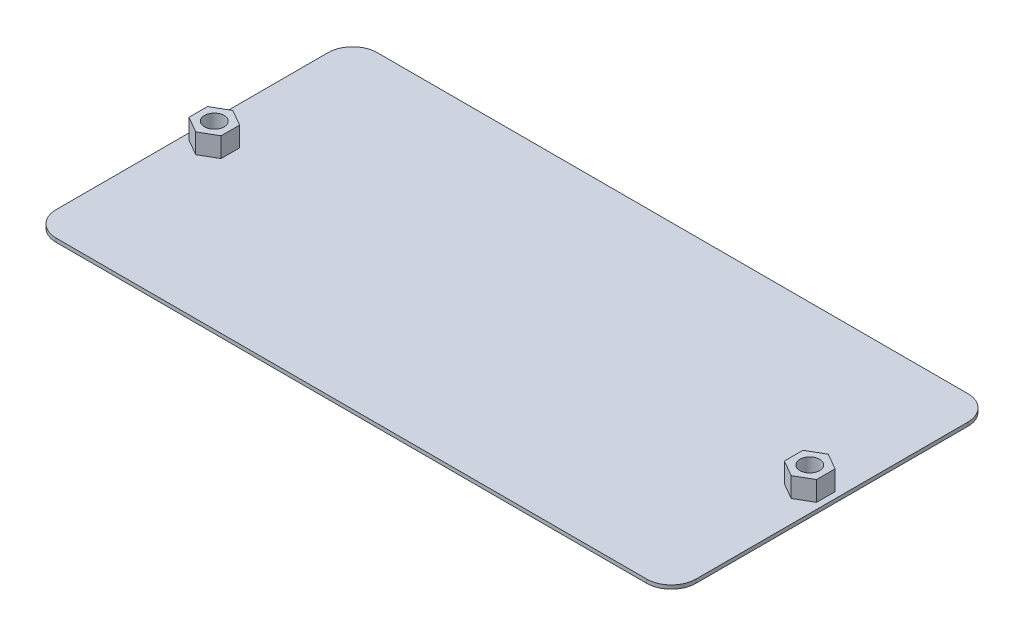
ISO-10303-21;
HEADER;
FILE_DESCRIPTION(('STEP AP214'),'2;1');
FILE_NAME('part.step','',(''),(''),'','','');
FILE_SCHEMA(('AUTOMOTIVE_DESIGN { 1 0 10303 214 1 1 1 1 }'));
ENDSEC;
DATA;
#1=APPLICATION_CONTEXT('core data for automotive mechanical design processes');
#2=APPLICATION_PROTOCOL_DEFINITION('international standard','automotive_design',2000,#1);
#3=PRODUCT_CONTEXT('',#1,'mechanical');
#4=PRODUCT('Part','Part','',(#3));
#5=PRODUCT_RELATED_PRODUCT_CATEGORY('part','',(#4));
#6=PRODUCT_DEFINITION_FORMATION('','',#4);
#7=PRODUCT_DEFINITION_CONTEXT('part definition',#1,'design');
#8=PRODUCT_DEFINITION('design','',#6,#7);
#9=PRODUCT_DEFINITION_SHAPE('','',#8);
#10=(LENGTH_UNIT() NAMED_UNIT(*) SI_UNIT(.MILLI.,.METRE.));
#11=(NAMED_UNIT(*) PLANE_ANGLE_UNIT() SI_UNIT($,.RADIAN.));
#12=(NAMED_UNIT(*) SI_UNIT($,.STERADIAN.) SOLID_ANGLE_UNIT());
#13=UNCERTAINTY_MEASURE_WITH_UNIT(LENGTH_MEASURE(1.E-05),#10,'distance_accuracy_value','');
#14=(GEOMETRIC_REPRESENTATION_CONTEXT(3) GLOBAL_UNCERTAINTY_ASSIGNED_CONTEXT((#13)) GLOBAL_UNIT_ASSIGNED_CONTEXT((#10,
#11,#12)) REPRESENTATION_CONTEXT('',''));
#15=CARTESIAN_POINT('',(0.,0.,0.));
#16=DIRECTION('',(0.,0.,1.));
#17=DIRECTION('',(1.,0.,0.));
#18=AXIS2_PLACEMENT_3D('',#15,#16,#17);
#19=CARTESIAN_POINT('',(249.,1.5,-120.));
#20=DIRECTION('',(0.,-1.,0.));
#21=DIRECTION('',(0.,0.,-1.));
#22=AXIS2_PLACEMENT_3D('',#19,#20,#21);
#23=PLANE('',#22);
#24=DIRECTION('',(0.866025403784438,0.,0.500000000000001));
#25=VECTOR('',#24,1.);
#26=CARTESIAN_POINT('',(2.49999999999997,1.5,-61.2472232502675));
#27=LINE('',#26,#25);
#28=CARTESIAN_POINT('',(2.49999999999997,1.5,-61.2472232502675));
#29=VERTEX_POINT('',#28);
#30=CARTESIAN_POINT('',(8.99999999999984,1.5,-57.4944465005349));
#31=VERTEX_POINT('',#30);
#32=EDGE_CURVE('E229',#29,#31,#27,.T.);
#33=ORIENTED_EDGE('',*,*,#32,.F.);
#34=DIRECTION('',(0.,0.,1.));
#35=VECTOR('',#34,1.);
#36=CARTESIAN_POINT('',(2.49999999999997,1.5,-68.7527767497326));
#37=LINE('',#36,#35);
#38=CARTESIAN_POINT('',(2.5,1.5,-68.7527767497326));
#39=VERTEX_POINT('',#38);
#40=EDGE_CURVE('E238',#39,#29,#37,.T.);
#41=ORIENTED_EDGE('',*,*,#40,.F.);
#42=DIRECTION('',(-0.866025403784439,0.,0.5));
#43=VECTOR('',#42,1.);
#44=CARTESIAN_POINT('',(8.99999999999986,1.5,-72.5055534994652));
#45=LINE('',#44,#43);
#46=CARTESIAN_POINT('',(8.99999999999984,1.5,-72.5055534994652));
#47=VERTEX_POINT('',#46);
#48=EDGE_CURVE('E269',#47,#39,#45,.T.);
#49=ORIENTED_EDGE('',*,*,#48,.F.);
#50=DIRECTION('',(-0.866025403784439,0.,-0.5));
#51=VECTOR('',#50,1.);
#52=CARTESIAN_POINT('',(15.4999999999998,1.5,-68.7527767497326));
#53=LINE('',#52,#51);
#54=CARTESIAN_POINT('',(15.4999999999998,1.5,-68.7527767497326));
#55=VERTEX_POINT('',#54);
#56=EDGE_CURVE('E265',#55,#47,#53,.T.);
#57=ORIENTED_EDGE('',*,*,#56,.F.);
#58=DIRECTION('',(0.,0.,-1.));
#59=VECTOR('',#58,1.);
#60=CARTESIAN_POINT('',(15.4999999999998,1.5,-61.2472232502674));
#61=LINE('',#60,#59);
#62=CARTESIAN_POINT('',(15.4999999999998,1.5,-61.2472232502674));
#63=VERTEX_POINT('',#62);
#64=EDGE_CURVE('E261',#63,#55,#61,.T.);
#65=ORIENTED_EDGE('',*,*,#64,.F.);
#66=DIRECTION('',(0.866025403784439,0.,-0.5));
#67=VECTOR('',#66,1.);
#68=CARTESIAN_POINT('',(8.99999999999984,1.5,-57.4944465005349));
#69=LINE('',#68,#67);
#70=EDGE_CURVE('E257',#31,#63,#69,.T.);
#71=ORIENTED_EDGE('',*,*,#70,.F.);
#72=EDGE_LOOP('',(#33,#41,#49,#57,#65,#71));
#73=FACE_BOUND('',#72,.T.);
#74=CARTESIAN_POINT('',(249.,1.5,-120.));
#75=DIRECTION('',(0.,1.,0.));
#76=DIRECTION('',(0.,0.,-1.));
#77=AXIS2_PLACEMENT_3D('',#74,#75,#76);
#78=CIRCLE('',#77,10.);
#79=CARTESIAN_POINT('',(259.,1.5,-120.));
#80=VERTEX_POINT('',#79);
#81=CARTESIAN_POINT('',(249.,1.5,-130.));
#82=VERTEX_POINT('',#81);
#83=EDGE_CURVE('E312',#80,#82,#78,.T.);
#84=ORIENTED_EDGE('',*,*,#83,.T.);
#85=DIRECTION('',(-1.,0.,0.));
#86=VECTOR('',#85,1.);
#87=CARTESIAN_POINT('',(9.99999999999991,1.5,-130.));
#88=LINE('',#87,#86);
#89=CARTESIAN_POINT('',(9.99999999999991,1.5,-130.));
#90=VERTEX_POINT('',#89);
#91=EDGE_CURVE('E316',#82,#90,#88,.T.);
#92=ORIENTED_EDGE('',*,*,#91,.T.);
#93=CARTESIAN_POINT('',(9.99999999999983,1.5,-120.));
#94=DIRECTION('',(0.,1.,0.));
#95=DIRECTION('',(0.,0.,-1.));
#96=AXIS2_PLACEMENT_3D('',#93,#94,#95);
#97=CIRCLE('',#96,10.);
#98=CARTESIAN_POINT('',(0.,1.5,-120.));
#99=VERTEX_POINT('',#98);
#100=EDGE_CURVE('E320',#90,#99,#97,.T.);
#101=ORIENTED_EDGE('',*,*,#100,.T.);
#102=DIRECTION('',(0.,0.,1.));
#103=VECTOR('',#102,1.);
#104=CARTESIAN_POINT('',(0.,1.5,-10.));
#105=LINE('',#104,#103);
#106=CARTESIAN_POINT('',(0.,1.5,-10.));
#107=VERTEX_POINT('',#106);
#108=EDGE_CURVE('E323',#99,#107,#105,.T.);
#109=ORIENTED_EDGE('',*,*,#108,.T.);
#110=CARTESIAN_POINT('',(9.99999999999984,1.5,-9.99999999999996));
#111=DIRECTION('',(0.,1.,0.));
#112=DIRECTION('',(0.,0.,-1.));
#113=AXIS2_PLACEMENT_3D('',#110,#111,#112);
#114=CIRCLE('',#113,10.);
#115=CARTESIAN_POINT('',(9.99999999999991,1.5,0.));
#116=VERTEX_POINT('',#115);
#117=EDGE_CURVE('E326',#107,#116,#114,.T.);
#118=ORIENTED_EDGE('',*,*,#117,.T.);
#119=DIRECTION('',(1.,0.,0.));
#120=VECTOR('',#119,1.);
#121=CARTESIAN_POINT('',(9.9999999999999,1.5,0.));
#122=LINE('',#121,#120);
#123=CARTESIAN_POINT('',(249.,1.5,0.));
#124=VERTEX_POINT('',#123);
#125=EDGE_CURVE('E329',#116,#124,#122,.T.);
#126=ORIENTED_EDGE('',*,*,#125,.T.);
#127=CARTESIAN_POINT('',(249.,1.5,-9.99999999999999));
#128=DIRECTION('',(0.,1.,0.));
#129=DIRECTION('',(0.,0.,1.));
#130=AXIS2_PLACEMENT_3D('',#127,#128,#129);
#131=CIRCLE('',#130,10.);
#132=CARTESIAN_POINT('',(259.,1.5,-10.));
#133=VERTEX_POINT('',#132);
#134=EDGE_CURVE('E332',#124,#133,#131,.T.);
#135=ORIENTED_EDGE('',*,*,#134,.T.);
#136=DIRECTION('',(0.,0.,-1.));
#137=VECTOR('',#136,1.);
#138=CARTESIAN_POINT('',(259.,1.5,-10.));
#139=LINE('',#138,#137);
#140=EDGE_CURVE('E335',#133,#80,#139,.T.);
#141=ORIENTED_EDGE('',*,*,#140,.T.);
#142=EDGE_LOOP('',(#84,#92,#101,#109,#118,#126,#135,#141));
#143=FACE_BOUND('',#142,.T.);
#144=DIRECTION('',(0.,0.,-1.));
#145=VECTOR('',#144,1.);
#146=CARTESIAN_POINT('',(256.500000000001,1.5,-68.7527767497335));
#147=LINE('',#146,#145);
#148=CARTESIAN_POINT('',(256.500000000001,1.5,-61.2472232502683));
#149=VERTEX_POINT('',#148);
#150=CARTESIAN_POINT('',(256.500000000001,1.5,-68.7527767497335));
#151=VERTEX_POINT('',#150);
#152=EDGE_CURVE('E210',#149,#151,#147,.T.);
#153=ORIENTED_EDGE('',*,*,#152,.F.);
#154=DIRECTION('',(0.86602540378444,0.,-0.499999999999998));
#155=VECTOR('',#154,1.);
#156=CARTESIAN_POINT('',(256.500000000001,1.5,-61.2472232502683));
#157=LINE('',#156,#155);
#158=CARTESIAN_POINT('',(250.000000000001,1.5,-57.4944465005358));
#159=VERTEX_POINT('',#158);
#160=EDGE_CURVE('E207',#159,#149,#157,.T.);
#161=ORIENTED_EDGE('',*,*,#160,.F.);
#162=DIRECTION('',(0.866025403784439,0.,0.499999999999999));
#163=VECTOR('',#162,1.);
#164=CARTESIAN_POINT('',(250.000000000001,1.5,-57.4944465005358));
#165=LINE('',#164,#163);
#166=CARTESIAN_POINT('',(243.5,1.5,-61.2472232502684));
#167=VERTEX_POINT('',#166);
#168=EDGE_CURVE('E587',#167,#159,#165,.T.);
#169=ORIENTED_EDGE('',*,*,#168,.F.);
#170=DIRECTION('',(0.,0.,1.));
#171=VECTOR('',#170,1.);
#172=CARTESIAN_POINT('',(243.5,1.5,-61.2472232502684));
#173=LINE('',#172,#171);
#174=CARTESIAN_POINT('',(243.5,1.5,-68.7527767497335));
#175=VERTEX_POINT('',#174);
#176=EDGE_CURVE('E583',#175,#167,#173,.T.);
#177=ORIENTED_EDGE('',*,*,#176,.F.);
#178=DIRECTION('',(-0.866025403784438,0.,0.500000000000001));
#179=VECTOR('',#178,1.);
#180=CARTESIAN_POINT('',(243.5,1.5,-68.7527767497335));
#181=LINE('',#180,#179);
#182=CARTESIAN_POINT('',(250.,1.5,-72.505553499466));
#183=VERTEX_POINT('',#182);
#184=EDGE_CURVE('E70',#183,#175,#181,.T.);
#185=ORIENTED_EDGE('',*,*,#184,.F.);
#186=DIRECTION('',(-0.866025403784442,0.,-0.499999999999995));
#187=VECTOR('',#186,1.);
#188=CARTESIAN_POINT('',(250.,1.5,-72.5055534994661));
#189=LINE('',#188,#187);
#190=EDGE_CURVE('E65',#151,#183,#189,.T.);
#191=ORIENTED_EDGE('',*,*,#190,.F.);
#192=EDGE_LOOP('',(#153,#161,#169,#177,#185,#191));
#193=FACE_BOUND('',#192,.T.);
#194=ADVANCED_FACE('F49',(#73,#143,#193),#23,.F.);
#195=CARTESIAN_POINT('',(249.,0.,-120.));
#196=DIRECTION('',(0.,-1.,0.));
#197=DIRECTION('',(0.,0.,-1.));
#198=AXIS2_PLACEMENT_3D('',#195,#196,#197);
#199=PLANE('',#198);
#200=CARTESIAN_POINT('',(8.99999999999984,0.,-65.0000000000001));
#201=DIRECTION('',(0.,1.,0.));
#202=DIRECTION('',(0.,0.,1.));
#203=AXIS2_PLACEMENT_3D('',#200,#201,#202);
#204=CIRCLE('',#203,4.5);
#205=CARTESIAN_POINT('',(8.99999999999984,0.,-60.5000000000001));
#206=VERTEX_POINT('',#205);
#207=EDGE_CURVE('E307',#206,#206,#204,.T.);
#208=ORIENTED_EDGE('',*,*,#207,.T.);
#209=EDGE_LOOP('',(#208));
#210=FACE_BOUND('',#209,.T.);
#211=CARTESIAN_POINT('',(249.,0.,-120.));
#212=DIRECTION('',(0.,1.,0.));
#213=DIRECTION('',(0.,0.,-1.));
#214=AXIS2_PLACEMENT_3D('',#211,#212,#213);
#215=CIRCLE('',#214,10.);
#216=CARTESIAN_POINT('',(259.,0.,-120.));
#217=VERTEX_POINT('',#216);
#218=CARTESIAN_POINT('',(249.,0.,-130.));
#219=VERTEX_POINT('',#218);
#220=EDGE_CURVE('E311',#217,#219,#215,.T.);
#221=ORIENTED_EDGE('',*,*,#220,.F.);
#222=DIRECTION('',(0.,0.,-1.));
#223=VECTOR('',#222,1.);
#224=CARTESIAN_POINT('',(259.,0.,-10.));
#225=LINE('',#224,#223);
#226=CARTESIAN_POINT('',(259.,0.,-10.));
#227=VERTEX_POINT('',#226);
#228=EDGE_CURVE('E317',#227,#217,#225,.T.);
#229=ORIENTED_EDGE('',*,*,#228,.F.);
#230=CARTESIAN_POINT('',(249.,0.,-9.99999999999999));
#231=DIRECTION('',(0.,1.,0.));
#232=DIRECTION('',(0.,0.,1.));
#233=AXIS2_PLACEMENT_3D('',#230,#231,#232);
#234=CIRCLE('',#233,10.);
#235=CARTESIAN_POINT('',(249.,0.,0.));
#236=VERTEX_POINT('',#235);
#237=EDGE_CURVE('E357',#236,#227,#234,.T.);
#238=ORIENTED_EDGE('',*,*,#237,.F.);
#239=DIRECTION('',(1.,0.,0.));
#240=VECTOR('',#239,1.);
#241=CARTESIAN_POINT('',(9.9999999999999,0.,0.));
#242=LINE('',#241,#240);
#243=CARTESIAN_POINT('',(9.99999999999991,0.,0.));
#244=VERTEX_POINT('',#243);
#245=EDGE_CURVE('E354',#244,#236,#242,.T.);
#246=ORIENTED_EDGE('',*,*,#245,.F.);
#247=CARTESIAN_POINT('',(9.99999999999984,0.,-9.99999999999996));
#248=DIRECTION('',(0.,1.,0.));
#249=DIRECTION('',(0.,0.,-1.));
#250=AXIS2_PLACEMENT_3D('',#247,#248,#249);
#251=CIRCLE('',#250,10.);
#252=CARTESIAN_POINT('',(0.,0.,-10.));
#253=VERTEX_POINT('',#252);
#254=EDGE_CURVE('E351',#253,#244,#251,.T.);
#255=ORIENTED_EDGE('',*,*,#254,.F.);
#256=DIRECTION('',(0.,0.,1.));
#257=VECTOR('',#256,1.);
#258=CARTESIAN_POINT('',(0.,0.,-10.));
#259=LINE('',#258,#257);
#260=CARTESIAN_POINT('',(0.,0.,-120.));
#261=VERTEX_POINT('',#260);
#262=EDGE_CURVE('E348',#261,#253,#259,.T.);
#263=ORIENTED_EDGE('',*,*,#262,.F.);
#264=CARTESIAN_POINT('',(9.99999999999983,0.,-120.));
#265=DIRECTION('',(0.,1.,0.));
#266=DIRECTION('',(0.,0.,-1.));
#267=AXIS2_PLACEMENT_3D('',#264,#265,#266);
#268=CIRCLE('',#267,10.);
#269=CARTESIAN_POINT('',(9.99999999999991,0.,-130.));
#270=VERTEX_POINT('',#269);
#271=EDGE_CURVE('E345',#270,#261,#268,.T.);
#272=ORIENTED_EDGE('',*,*,#271,.F.);
#273=DIRECTION('',(-1.,0.,0.));
#274=VECTOR('',#273,1.);
#275=CARTESIAN_POINT('',(9.99999999999991,0.,-130.));
#276=LINE('',#275,#274);
#277=EDGE_CURVE('E342',#219,#270,#276,.T.);
#278=ORIENTED_EDGE('',*,*,#277,.F.);
#279=EDGE_LOOP('',(#221,#229,#238,#246,#255,#263,#272,#278));
#280=FACE_BOUND('',#279,.T.);
#281=CARTESIAN_POINT('',(250.,0.,-65.000000000001));
#282=DIRECTION('',(0.,1.,0.));
#283=DIRECTION('',(0.,0.,-1.));
#284=AXIS2_PLACEMENT_3D('',#281,#282,#283);
#285=CIRCLE('',#284,4.50000000000002);
#286=CARTESIAN_POINT('',(250.,0.,-69.500000000001));
#287=VERTEX_POINT('',#286);
#288=EDGE_CURVE('E303',#287,#287,#285,.T.);
#289=ORIENTED_EDGE('',*,*,#288,.T.);
#290=EDGE_LOOP('',(#289));
#291=FACE_BOUND('',#290,.T.);
#292=ADVANCED_FACE('F398',(#210,#280,#291),#199,.T.);
#293=CARTESIAN_POINT('',(249.,1.5,-120.));
#294=DIRECTION('',(0.,-1.,0.));
#295=DIRECTION('',(0.,0.,-1.));
#296=AXIS2_PLACEMENT_3D('',#293,#294,#295);
#297=CYLINDRICAL_SURFACE('',#296,10.);
#298=ORIENTED_EDGE('',*,*,#220,.T.);
#299=DIRECTION('',(0.,-1.,0.));
#300=VECTOR('',#299,1.);
#301=CARTESIAN_POINT('',(249.,1.5,-130.));
#302=LINE('',#301,#300);
#303=EDGE_CURVE('E11',#82,#219,#302,.T.);
#304=ORIENTED_EDGE('',*,*,#303,.F.);
#305=ORIENTED_EDGE('',*,*,#83,.F.);
#306=DIRECTION('',(0.,-1.,0.));
#307=VECTOR('',#306,1.);
#308=CARTESIAN_POINT('',(259.,1.5,-120.));
#309=LINE('',#308,#307);
#310=EDGE_CURVE('E338',#80,#217,#309,.T.);
#311=ORIENTED_EDGE('',*,*,#310,.T.);
#312=EDGE_LOOP('',(#298,#304,#305,#311));
#313=FACE_BOUND('',#312,.T.);
#314=ADVANCED_FACE('F51',(#313),#297,.T.);
#315=CARTESIAN_POINT('',(9.99999999999991,1.5,-130.));
#316=DIRECTION('',(0.,0.,1.));
#317=DIRECTION('',(1.,0.,0.));
#318=AXIS2_PLACEMENT_3D('',#315,#316,#317);
#319=PLANE('',#318);
#320=ORIENTED_EDGE('',*,*,#277,.T.);
#321=DIRECTION('',(0.,-1.,0.));
#322=VECTOR('',#321,1.);
#323=CARTESIAN_POINT('',(9.99999999999991,1.5,-130.));
#324=LINE('',#323,#322);
#325=EDGE_CURVE('E58',#90,#270,#324,.T.);
#326=ORIENTED_EDGE('',*,*,#325,.F.);
#327=ORIENTED_EDGE('',*,*,#91,.F.);
#328=ORIENTED_EDGE('',*,*,#303,.T.);
#329=EDGE_LOOP('',(#320,#326,#327,#328));
#330=FACE_BOUND('',#329,.T.);
#331=ADVANCED_FACE('F415',(#330),#319,.F.);
#332=CARTESIAN_POINT('',(9.99999999999983,1.5,-120.));
#333=DIRECTION('',(0.,-1.,0.));
#334=DIRECTION('',(0.,0.,-1.));
#335=AXIS2_PLACEMENT_3D('',#332,#333,#334);
#336=CYLINDRICAL_SURFACE('',#335,10.);
#337=ORIENTED_EDGE('',*,*,#271,.T.);
#338=DIRECTION('',(0.,-1.,0.));
#339=VECTOR('',#338,1.);
#340=CARTESIAN_POINT('',(0.,1.5,-120.));
#341=LINE('',#340,#339);
#342=EDGE_CURVE('E381',#99,#261,#341,.T.);
#343=ORIENTED_EDGE('',*,*,#342,.F.);
#344=ORIENTED_EDGE('',*,*,#100,.F.);
#345=ORIENTED_EDGE('',*,*,#325,.T.);
#346=EDGE_LOOP('',(#337,#343,#344,#345));
#347=FACE_BOUND('',#346,.T.);
#348=ADVANCED_FACE('F392',(#347),#336,.T.);
#349=CARTESIAN_POINT('',(0.,1.5,-10.));
#350=DIRECTION('',(1.,0.,0.));
#351=DIRECTION('',(0.,0.,-1.));
#352=AXIS2_PLACEMENT_3D('',#349,#350,#351);
#353=PLANE('',#352);
#354=ORIENTED_EDGE('',*,*,#262,.T.);
#355=DIRECTION('',(0.,-1.,0.));
#356=VECTOR('',#355,1.);
#357=CARTESIAN_POINT('',(0.,1.5,-10.));
#358=LINE('',#357,#356);
#359=EDGE_CURVE('E377',#107,#253,#358,.T.);
#360=ORIENTED_EDGE('',*,*,#359,.F.);
#361=ORIENTED_EDGE('',*,*,#108,.F.);
#362=ORIENTED_EDGE('',*,*,#342,.T.);
#363=EDGE_LOOP('',(#354,#360,#361,#362));
#364=FACE_BOUND('',#363,.T.);
#365=ADVANCED_FACE('F404',(#364),#353,.F.);
#366=CARTESIAN_POINT('',(9.99999999999984,1.5,-9.99999999999996));
#367=DIRECTION('',(0.,-1.,0.));
#368=DIRECTION('',(0.,0.,-1.));
#369=AXIS2_PLACEMENT_3D('',#366,#367,#368);
#370=CYLINDRICAL_SURFACE('',#369,10.);
#371=ORIENTED_EDGE('',*,*,#254,.T.);
#372=DIRECTION('',(0.,-1.,0.));
#373=VECTOR('',#372,1.);
#374=CARTESIAN_POINT('',(9.99999999999991,1.5,0.));
#375=LINE('',#374,#373);
#376=EDGE_CURVE('E373',#116,#244,#375,.T.);
#377=ORIENTED_EDGE('',*,*,#376,.F.);
#378=ORIENTED_EDGE('',*,*,#117,.F.);
#379=ORIENTED_EDGE('',*,*,#359,.T.);
#380=EDGE_LOOP('',(#371,#377,#378,#379));
#381=FACE_BOUND('',#380,.T.);
#382=ADVANCED_FACE('F408',(#381),#370,.T.);
#383=CARTESIAN_POINT('',(9.9999999999999,1.5,0.));
#384=DIRECTION('',(0.,0.,-1.));
#385=DIRECTION('',(-1.,0.,0.));
#386=AXIS2_PLACEMENT_3D('',#383,#384,#385);
#387=PLANE('',#386);
#388=ORIENTED_EDGE('',*,*,#245,.T.);
#389=DIRECTION('',(0.,-1.,0.));
#390=VECTOR('',#389,1.);
#391=CARTESIAN_POINT('',(249.,1.5,0.));
#392=LINE('',#391,#390);
#393=EDGE_CURVE('E369',#124,#236,#392,.T.);
#394=ORIENTED_EDGE('',*,*,#393,.F.);
#395=ORIENTED_EDGE('',*,*,#125,.F.);
#396=ORIENTED_EDGE('',*,*,#376,.T.);
#397=EDGE_LOOP('',(#388,#394,#395,#396));
#398=FACE_BOUND('',#397,.T.);
#399=ADVANCED_FACE('F428',(#398),#387,.F.);
#400=CARTESIAN_POINT('',(249.,1.5,-9.99999999999999));
#401=DIRECTION('',(0.,-1.,0.));
#402=DIRECTION('',(0.,0.,-1.));
#403=AXIS2_PLACEMENT_3D('',#400,#401,#402);
#404=CYLINDRICAL_SURFACE('',#403,10.);
#405=ORIENTED_EDGE('',*,*,#237,.T.);
#406=DIRECTION('',(0.,-1.,0.));
#407=VECTOR('',#406,1.);
#408=CARTESIAN_POINT('',(259.,1.5,-10.));
#409=LINE('',#408,#407);
#410=EDGE_CURVE('E365',#133,#227,#409,.T.);
#411=ORIENTED_EDGE('',*,*,#410,.F.);
#412=ORIENTED_EDGE('',*,*,#134,.F.);
#413=ORIENTED_EDGE('',*,*,#393,.T.);
#414=EDGE_LOOP('',(#405,#411,#412,#413));
#415=FACE_BOUND('',#414,.T.);
#416=ADVANCED_FACE('F426',(#415),#404,.T.);
#417=CARTESIAN_POINT('',(259.,1.5,-10.));
#418=DIRECTION('',(-1.,0.,0.));
#419=DIRECTION('',(0.,0.,1.));
#420=AXIS2_PLACEMENT_3D('',#417,#418,#419);
#421=PLANE('',#420);
#422=ORIENTED_EDGE('',*,*,#228,.T.);
#423=ORIENTED_EDGE('',*,*,#310,.F.);
#424=ORIENTED_EDGE('',*,*,#140,.F.);
#425=ORIENTED_EDGE('',*,*,#410,.T.);
#426=EDGE_LOOP('',(#422,#423,#424,#425));
#427=FACE_BOUND('',#426,.T.);
#428=ADVANCED_FACE('F421',(#427),#421,.F.);
#429=CARTESIAN_POINT('',(8.99999999999984,1.5,-65.0000000000001));
#430=DIRECTION('',(0.,-1.,0.));
#431=DIRECTION('',(0.,0.,-1.));
#432=AXIS2_PLACEMENT_3D('',#429,#430,#431);
#433=CYLINDRICAL_SURFACE('',#432,4.5);
#434=CARTESIAN_POINT('',(8.99999999999984,1.5,-65.0000000000001));
#435=DIRECTION('',(0.,1.,0.));
#436=DIRECTION('',(0.,0.,1.));
#437=AXIS2_PLACEMENT_3D('',#434,#435,#436);
#438=CIRCLE('',#437,4.5);
#439=CARTESIAN_POINT('',(8.99999999999984,1.5,-60.5000000000001));
#440=VERTEX_POINT('',#439);
#441=EDGE_CURVE('E299',#440,#440,#438,.T.);
#442=ORIENTED_EDGE('',*,*,#441,.T.);
#443=EDGE_LOOP('',(#442));
#444=FACE_BOUND('',#443,.T.);
#445=ORIENTED_EDGE('',*,*,#207,.F.);
#446=EDGE_LOOP('',(#445));
#447=FACE_BOUND('',#446,.T.);
#448=ADVANCED_FACE('F446',(#444,#447),#433,.F.);
#449=CARTESIAN_POINT('',(250.,1.5,-65.000000000001));
#450=DIRECTION('',(0.,-1.,0.));
#451=DIRECTION('',(0.,0.,-1.));
#452=AXIS2_PLACEMENT_3D('',#449,#450,#451);
#453=CYLINDRICAL_SURFACE('',#452,4.50000000000002);
#454=CARTESIAN_POINT('',(250.,1.5,-65.000000000001));
#455=DIRECTION('',(0.,-1.,0.));
#456=DIRECTION('',(0.,0.,-1.));
#457=AXIS2_PLACEMENT_3D('',#454,#455,#456);
#458=CIRCLE('',#457,4.50000000000002);
#459=CARTESIAN_POINT('',(250.,1.5,-69.500000000001));
#460=VERTEX_POINT('',#459);
#461=EDGE_CURVE('E212',#460,#460,#458,.T.);
#462=ORIENTED_EDGE('',*,*,#461,.F.);
#463=EDGE_LOOP('',(#462));
#464=FACE_BOUND('',#463,.T.);
#465=ORIENTED_EDGE('',*,*,#288,.F.);
#466=EDGE_LOOP('',(#465));
#467=FACE_BOUND('',#466,.T.);
#468=ADVANCED_FACE('F453',(#464,#467),#453,.F.);
#469=CARTESIAN_POINT('',(0.,1.5,0.));
#470=DIRECTION('',(0.,1.,0.));
#471=DIRECTION('',(0.,0.,1.));
#472=AXIS2_PLACEMENT_3D('',#469,#470,#471);
#473=PLANE('',#472);
#474=CARTESIAN_POINT('',(8.99999999999984,1.5,-65.0000000000001));
#475=DIRECTION('',(0.,1.,0.));
#476=DIRECTION('',(0.,0.,-1.));
#477=AXIS2_PLACEMENT_3D('',#474,#475,#476);
#478=CIRCLE('',#477,4.00000000000002);
#479=CARTESIAN_POINT('',(8.99999999999984,1.5,-69.0000000000001));
#480=VERTEX_POINT('',#479);
#481=EDGE_CURVE('E219',#480,#480,#478,.T.);
#482=ORIENTED_EDGE('',*,*,#481,.T.);
#483=EDGE_LOOP('',(#482));
#484=FACE_BOUND('',#483,.T.);
#485=ORIENTED_EDGE('',*,*,#441,.F.);
#486=EDGE_LOOP('',(#485));
#487=FACE_BOUND('',#486,.T.);
#488=ADVANCED_FACE('F458',(#484,#487),#473,.F.);
#489=CARTESIAN_POINT('',(0.,9.50000000000001,0.));
#490=DIRECTION('',(0.,1.,0.));
#491=DIRECTION('',(0.,0.,1.));
#492=AXIS2_PLACEMENT_3D('',#489,#490,#491);
#493=PLANE('',#492);
#494=DIRECTION('',(0.866025403784438,0.,0.500000000000001));
#495=VECTOR('',#494,1.);
#496=CARTESIAN_POINT('',(2.49999999999997,9.50000000000001,-61.2472232502675));
#497=LINE('',#496,#495);
#498=CARTESIAN_POINT('',(2.49999999999997,9.50000000000001,-61.2472232502675));
#499=VERTEX_POINT('',#498);
#500=CARTESIAN_POINT('',(8.99999999999984,9.50000000000001,-57.4944465005349));
#501=VERTEX_POINT('',#500);
#502=EDGE_CURVE('E233',#499,#501,#497,.T.);
#503=ORIENTED_EDGE('',*,*,#502,.T.);
#504=DIRECTION('',(0.866025403784439,0.,-0.5));
#505=VECTOR('',#504,1.);
#506=CARTESIAN_POINT('',(8.99999999999984,9.50000000000001,-57.4944465005349));
#507=LINE('',#506,#505);
#508=CARTESIAN_POINT('',(15.4999999999998,9.50000000000001,-61.2472232502674));
#509=VERTEX_POINT('',#508);
#510=EDGE_CURVE('E237',#501,#509,#507,.T.);
#511=ORIENTED_EDGE('',*,*,#510,.T.);
#512=DIRECTION('',(0.,0.,-1.));
#513=VECTOR('',#512,1.);
#514=CARTESIAN_POINT('',(15.4999999999998,9.50000000000001,-61.2472232502674));
#515=LINE('',#514,#513);
#516=CARTESIAN_POINT('',(15.4999999999998,9.50000000000001,-68.7527767497326));
#517=VERTEX_POINT('',#516);
#518=EDGE_CURVE('E241',#509,#517,#515,.T.);
#519=ORIENTED_EDGE('',*,*,#518,.T.);
#520=DIRECTION('',(-0.866025403784439,0.,-0.5));
#521=VECTOR('',#520,1.);
#522=CARTESIAN_POINT('',(15.4999999999998,9.50000000000001,-68.7527767497326));
#523=LINE('',#522,#521);
#524=CARTESIAN_POINT('',(8.99999999999986,9.50000000000001,-72.5055534994652));
#525=VERTEX_POINT('',#524);
#526=EDGE_CURVE('E244',#517,#525,#523,.T.);
#527=ORIENTED_EDGE('',*,*,#526,.T.);
#528=DIRECTION('',(-0.866025403784439,0.,0.5));
#529=VECTOR('',#528,1.);
#530=CARTESIAN_POINT('',(8.99999999999986,9.50000000000001,-72.5055534994652));
#531=LINE('',#530,#529);
#532=CARTESIAN_POINT('',(2.49999999999997,9.50000000000001,-68.7527767497326));
#533=VERTEX_POINT('',#532);
#534=EDGE_CURVE('E247',#525,#533,#531,.T.);
#535=ORIENTED_EDGE('',*,*,#534,.T.);
#536=DIRECTION('',(0.,0.,1.));
#537=VECTOR('',#536,1.);
#538=CARTESIAN_POINT('',(2.49999999999997,9.50000000000001,-68.7527767497326));
#539=LINE('',#538,#537);
#540=EDGE_CURVE('E250',#533,#499,#539,.T.);
#541=ORIENTED_EDGE('',*,*,#540,.T.);
#542=EDGE_LOOP('',(#503,#511,#519,#527,#535,#541));
#543=FACE_BOUND('',#542,.T.);
#544=CARTESIAN_POINT('',(8.99999999999984,9.50000000000001,-65.0000000000001));
#545=DIRECTION('',(0.,1.,0.));
#546=DIRECTION('',(0.,0.,-1.));
#547=AXIS2_PLACEMENT_3D('',#544,#545,#546);
#548=CIRCLE('',#547,4.00000000000002);
#549=CARTESIAN_POINT('',(8.99999999999984,9.50000000000001,-69.0000000000001));
#550=VERTEX_POINT('',#549);
#551=EDGE_CURVE('E225',#550,#550,#548,.T.);
#552=ORIENTED_EDGE('',*,*,#551,.F.);
#553=EDGE_LOOP('',(#552));
#554=FACE_BOUND('',#553,.T.);
#555=ADVANCED_FACE('F465',(#543,#554),#493,.T.);
#556=CARTESIAN_POINT('',(2.49999999999997,9.50000000000001,-61.2472232502675));
#557=DIRECTION('',(0.500000000000001,0.,-0.866025403784438));
#558=DIRECTION('',(-0.866025403784438,0.,-0.500000000000001));
#559=AXIS2_PLACEMENT_3D('',#556,#557,#558);
#560=PLANE('',#559);
#561=ORIENTED_EDGE('',*,*,#32,.T.);
#562=DIRECTION('',(0.,-1.,0.));
#563=VECTOR('',#562,1.);
#564=CARTESIAN_POINT('',(8.99999999999984,9.50000000000001,-57.4944465005349));
#565=LINE('',#564,#563);
#566=EDGE_CURVE('E295',#501,#31,#565,.T.);
#567=ORIENTED_EDGE('',*,*,#566,.F.);
#568=ORIENTED_EDGE('',*,*,#502,.F.);
#569=DIRECTION('',(0.,-1.,0.));
#570=VECTOR('',#569,1.);
#571=CARTESIAN_POINT('',(2.49999999999997,9.50000000000001,-61.2472232502675));
#572=LINE('',#571,#570);
#573=EDGE_CURVE('E253',#499,#29,#572,.T.);
#574=ORIENTED_EDGE('',*,*,#573,.T.);
#575=EDGE_LOOP('',(#561,#567,#568,#574));
#576=FACE_BOUND('',#575,.T.);
#577=ADVANCED_FACE('F471',(#576),#560,.F.);
#578=CARTESIAN_POINT('',(8.99999999999984,9.50000000000001,-57.4944465005349));
#579=DIRECTION('',(-0.5,0.,-0.866025403784439));
#580=DIRECTION('',(-0.866025403784439,0.,0.5));
#581=AXIS2_PLACEMENT_3D('',#578,#579,#580);
#582=PLANE('',#581);
#583=ORIENTED_EDGE('',*,*,#70,.T.);
#584=DIRECTION('',(0.,-1.,0.));
#585=VECTOR('',#584,1.);
#586=CARTESIAN_POINT('',(15.4999999999998,9.50000000000001,-61.2472232502674));
#587=LINE('',#586,#585);
#588=EDGE_CURVE('E291',#509,#63,#587,.T.);
#589=ORIENTED_EDGE('',*,*,#588,.F.);
#590=ORIENTED_EDGE('',*,*,#510,.F.);
#591=ORIENTED_EDGE('',*,*,#566,.T.);
#592=EDGE_LOOP('',(#583,#589,#590,#591));
#593=FACE_BOUND('',#592,.T.);
#594=ADVANCED_FACE('F492',(#593),#582,.F.);
#595=CARTESIAN_POINT('',(15.4999999999998,9.50000000000001,-61.2472232502674));
#596=DIRECTION('',(-1.,0.,0.));
#597=DIRECTION('',(0.,0.,1.));
#598=AXIS2_PLACEMENT_3D('',#595,#596,#597);
#599=PLANE('',#598);
#600=ORIENTED_EDGE('',*,*,#64,.T.);
#601=DIRECTION('',(0.,-1.,0.));
#602=VECTOR('',#601,1.);
#603=CARTESIAN_POINT('',(15.4999999999998,9.50000000000001,-68.7527767497326));
#604=LINE('',#603,#602);
#605=EDGE_CURVE('E287',#517,#55,#604,.T.);
#606=ORIENTED_EDGE('',*,*,#605,.F.);
#607=ORIENTED_EDGE('',*,*,#518,.F.);
#608=ORIENTED_EDGE('',*,*,#588,.T.);
#609=EDGE_LOOP('',(#600,#606,#607,#608));
#610=FACE_BOUND('',#609,.T.);
#611=ADVANCED_FACE('F488',(#610),#599,.F.);
#612=CARTESIAN_POINT('',(15.4999999999998,9.50000000000001,-68.7527767497326));
#613=DIRECTION('',(-0.5,0.,0.866025403784439));
#614=DIRECTION('',(0.866025403784439,0.,0.5));
#615=AXIS2_PLACEMENT_3D('',#612,#613,#614);
#616=PLANE('',#615);
#617=ORIENTED_EDGE('',*,*,#56,.T.);
#618=DIRECTION('',(0.,-1.,0.));
#619=VECTOR('',#618,1.);
#620=CARTESIAN_POINT('',(8.99999999999986,9.50000000000001,-72.5055534994652));
#621=LINE('',#620,#619);
#622=EDGE_CURVE('E283',#525,#47,#621,.T.);
#623=ORIENTED_EDGE('',*,*,#622,.F.);
#624=ORIENTED_EDGE('',*,*,#526,.F.);
#625=ORIENTED_EDGE('',*,*,#605,.T.);
#626=EDGE_LOOP('',(#617,#623,#624,#625));
#627=FACE_BOUND('',#626,.T.);
#628=ADVANCED_FACE('F484',(#627),#616,.F.);
#629=CARTESIAN_POINT('',(8.99999999999986,9.50000000000001,-72.5055534994652));
#630=DIRECTION('',(0.5,0.,0.866025403784439));
#631=DIRECTION('',(0.866025403784439,0.,-0.5));
#632=AXIS2_PLACEMENT_3D('',#629,#630,#631);
#633=PLANE('',#632);
#634=ORIENTED_EDGE('',*,*,#48,.T.);
#635=DIRECTION('',(0.,-1.,0.));
#636=VECTOR('',#635,1.);
#637=CARTESIAN_POINT('',(2.49999999999997,9.50000000000001,-68.7527767497326));
#638=LINE('',#637,#636);
#639=EDGE_CURVE('E279',#533,#39,#638,.T.);
#640=ORIENTED_EDGE('',*,*,#639,.F.);
#641=ORIENTED_EDGE('',*,*,#534,.F.);
#642=ORIENTED_EDGE('',*,*,#622,.T.);
#643=EDGE_LOOP('',(#634,#640,#641,#642));
#644=FACE_BOUND('',#643,.T.);
#645=ADVANCED_FACE('F480',(#644),#633,.F.);
#646=CARTESIAN_POINT('',(2.49999999999997,9.50000000000001,-68.7527767497326));
#647=DIRECTION('',(1.,0.,0.));
#648=DIRECTION('',(0.,0.,-1.));
#649=AXIS2_PLACEMENT_3D('',#646,#647,#648);
#650=PLANE('',#649);
#651=ORIENTED_EDGE('',*,*,#40,.T.);
#652=ORIENTED_EDGE('',*,*,#573,.F.);
#653=ORIENTED_EDGE('',*,*,#540,.F.);
#654=ORIENTED_EDGE('',*,*,#639,.T.);
#655=EDGE_LOOP('',(#651,#652,#653,#654));
#656=FACE_BOUND('',#655,.T.);
#657=ADVANCED_FACE('F476',(#656),#650,.F.);
#658=CARTESIAN_POINT('',(8.99999999999984,9.50000000000001,-65.0000000000001));
#659=DIRECTION('',(0.,-1.,0.));
#660=DIRECTION('',(0.,0.,-1.));
#661=AXIS2_PLACEMENT_3D('',#658,#659,#660);
#662=CYLINDRICAL_SURFACE('',#661,4.00000000000002);
#663=ORIENTED_EDGE('',*,*,#551,.T.);
#664=EDGE_LOOP('',(#663));
#665=FACE_BOUND('',#664,.T.);
#666=ORIENTED_EDGE('',*,*,#481,.F.);
#667=EDGE_LOOP('',(#666));
#668=FACE_BOUND('',#667,.T.);
#669=ADVANCED_FACE('F479',(#665,#668),#662,.F.);
#670=CARTESIAN_POINT('',(0.,1.5,0.));
#671=DIRECTION('',(0.,-1.,0.));
#672=DIRECTION('',(0.,0.,-1.));
#673=AXIS2_PLACEMENT_3D('',#670,#671,#672);
#674=PLANE('',#673);
#675=CARTESIAN_POINT('',(250.000000000001,1.5,-65.000000000001));
#676=DIRECTION('',(0.,1.,0.));
#677=DIRECTION('',(0.,0.,1.));
#678=AXIS2_PLACEMENT_3D('',#675,#676,#677);
#679=CIRCLE('',#678,3.99999999999999);
#680=CARTESIAN_POINT('',(250.000000000001,1.5,-61.000000000001));
#681=VERTEX_POINT('',#680);
#682=EDGE_CURVE('E558',#681,#681,#679,.T.);
#683=ORIENTED_EDGE('',*,*,#682,.T.);
#684=EDGE_LOOP('',(#683));
#685=FACE_BOUND('',#684,.T.);
#686=ORIENTED_EDGE('',*,*,#461,.T.);
#687=EDGE_LOOP('',(#686));
#688=FACE_BOUND('',#687,.T.);
#689=ADVANCED_FACE('F517',(#685,#688),#674,.T.);
#690=CARTESIAN_POINT('',(0.,9.50000000000001,0.));
#691=DIRECTION('',(0.,-1.,0.));
#692=DIRECTION('',(0.,0.,-1.));
#693=AXIS2_PLACEMENT_3D('',#690,#691,#692);
#694=PLANE('',#693);
#695=DIRECTION('',(0.,0.,-1.));
#696=VECTOR('',#695,1.);
#697=CARTESIAN_POINT('',(256.500000000001,9.50000000000004,-68.7527767497335));
#698=LINE('',#697,#696);
#699=CARTESIAN_POINT('',(256.500000000001,9.50000000000004,-61.2472232502683));
#700=VERTEX_POINT('',#699);
#701=CARTESIAN_POINT('',(256.500000000001,9.50000000000004,-68.7527767497335));
#702=VERTEX_POINT('',#701);
#703=EDGE_CURVE('E196',#700,#702,#698,.T.);
#704=ORIENTED_EDGE('',*,*,#703,.T.);
#705=DIRECTION('',(-0.866025403784442,0.,-0.499999999999995));
#706=VECTOR('',#705,1.);
#707=CARTESIAN_POINT('',(250.,9.50000000000001,-72.5055534994661));
#708=LINE('',#707,#706);
#709=CARTESIAN_POINT('',(250.,9.50000000000001,-72.5055534994661));
#710=VERTEX_POINT('',#709);
#711=EDGE_CURVE('E184',#702,#710,#708,.T.);
#712=ORIENTED_EDGE('',*,*,#711,.T.);
#713=DIRECTION('',(-0.866025403784438,0.,0.500000000000001));
#714=VECTOR('',#713,1.);
#715=CARTESIAN_POINT('',(243.5,9.50000000000001,-68.7527767497335));
#716=LINE('',#715,#714);
#717=CARTESIAN_POINT('',(243.5,9.50000000000001,-68.7527767497335));
#718=VERTEX_POINT('',#717);
#719=EDGE_CURVE('E195',#710,#718,#716,.T.);
#720=ORIENTED_EDGE('',*,*,#719,.T.);
#721=DIRECTION('',(0.,0.,1.));
#722=VECTOR('',#721,1.);
#723=CARTESIAN_POINT('',(243.5,9.50000000000001,-61.2472232502684));
#724=LINE('',#723,#722);
#725=CARTESIAN_POINT('',(243.5,9.50000000000001,-61.2472232502684));
#726=VERTEX_POINT('',#725);
#727=EDGE_CURVE('E568',#718,#726,#724,.T.);
#728=ORIENTED_EDGE('',*,*,#727,.T.);
#729=DIRECTION('',(0.866025403784439,0.,0.499999999999999));
#730=VECTOR('',#729,1.);
#731=CARTESIAN_POINT('',(250.000000000001,9.50000000000001,-57.4944465005358));
#732=LINE('',#731,#730);
#733=CARTESIAN_POINT('',(250.000000000001,9.50000000000001,-57.4944465005358));
#734=VERTEX_POINT('',#733);
#735=EDGE_CURVE('E571',#726,#734,#732,.T.);
#736=ORIENTED_EDGE('',*,*,#735,.T.);
#737=DIRECTION('',(0.86602540378444,0.,-0.499999999999998));
#738=VECTOR('',#737,1.);
#739=CARTESIAN_POINT('',(256.500000000001,9.50000000000004,-61.2472232502683));
#740=LINE('',#739,#738);
#741=EDGE_CURVE('E202',#734,#700,#740,.T.);
#742=ORIENTED_EDGE('',*,*,#741,.T.);
#743=EDGE_LOOP('',(#704,#712,#720,#728,#736,#742));
#744=FACE_BOUND('',#743,.T.);
#745=CARTESIAN_POINT('',(250.000000000001,9.50000000000001,-65.000000000001));
#746=DIRECTION('',(0.,1.,0.));
#747=DIRECTION('',(0.,0.,1.));
#748=AXIS2_PLACEMENT_3D('',#745,#746,#747);
#749=CIRCLE('',#748,3.99999999999999);
#750=CARTESIAN_POINT('',(250.000000000001,9.50000000000001,-61.000000000001));
#751=VERTEX_POINT('',#750);
#752=EDGE_CURVE('E555',#751,#751,#749,.T.);
#753=ORIENTED_EDGE('',*,*,#752,.F.);
#754=EDGE_LOOP('',(#753));
#755=FACE_BOUND('',#754,.T.);
#756=ADVANCED_FACE('F199',(#744,#755),#694,.F.);
#757=CARTESIAN_POINT('',(256.500000000001,9.50000000000004,-68.7527767497335));
#758=DIRECTION('',(-1.,0.,0.));
#759=DIRECTION('',(0.,0.,1.));
#760=AXIS2_PLACEMENT_3D('',#757,#758,#759);
#761=PLANE('',#760);
#762=ORIENTED_EDGE('',*,*,#152,.T.);
#763=DIRECTION('',(0.,-1.,0.));
#764=VECTOR('',#763,1.);
#765=CARTESIAN_POINT('',(256.500000000001,9.50000000000004,-68.7527767497335));
#766=LINE('',#765,#764);
#767=EDGE_CURVE('E188',#702,#151,#766,.T.);
#768=ORIENTED_EDGE('',*,*,#767,.F.);
#769=ORIENTED_EDGE('',*,*,#703,.F.);
#770=DIRECTION('',(0.,-1.,0.));
#771=VECTOR('',#770,1.);
#772=CARTESIAN_POINT('',(256.500000000001,9.50000000000004,-61.2472232502683));
#773=LINE('',#772,#771);
#774=EDGE_CURVE('E576',#700,#149,#773,.T.);
#775=ORIENTED_EDGE('',*,*,#774,.T.);
#776=EDGE_LOOP('',(#762,#768,#769,#775));
#777=FACE_BOUND('',#776,.T.);
#778=ADVANCED_FACE('F209',(#777),#761,.F.);
#779=CARTESIAN_POINT('',(250.,9.50000000000001,-72.5055534994661));
#780=DIRECTION('',(-0.499999999999995,0.,0.866025403784442));
#781=DIRECTION('',(0.866025403784442,0.,0.499999999999995));
#782=AXIS2_PLACEMENT_3D('',#779,#780,#781);
#783=PLANE('',#782);
#784=ORIENTED_EDGE('',*,*,#190,.T.);
#785=DIRECTION('',(0.,-1.,0.));
#786=VECTOR('',#785,1.);
#787=CARTESIAN_POINT('',(250.,9.50000000000001,-72.5055534994661));
#788=LINE('',#787,#786);
#789=EDGE_CURVE('E191',#710,#183,#788,.T.);
#790=ORIENTED_EDGE('',*,*,#789,.F.);
#791=ORIENTED_EDGE('',*,*,#711,.F.);
#792=ORIENTED_EDGE('',*,*,#767,.T.);
#793=EDGE_LOOP('',(#784,#790,#791,#792));
#794=FACE_BOUND('',#793,.T.);
#795=ADVANCED_FACE('F186',(#794),#783,.F.);
#796=CARTESIAN_POINT('',(243.5,9.50000000000001,-68.7527767497335));
#797=DIRECTION('',(0.500000000000001,0.,0.866025403784438));
#798=DIRECTION('',(0.866025403784438,0.,-0.500000000000001));
#799=AXIS2_PLACEMENT_3D('',#796,#797,#798);
#800=PLANE('',#799);
#801=ORIENTED_EDGE('',*,*,#184,.T.);
#802=DIRECTION('',(0.,-1.,0.));
#803=VECTOR('',#802,1.);
#804=CARTESIAN_POINT('',(243.5,9.50000000000001,-68.7527767497335));
#805=LINE('',#804,#803);
#806=EDGE_CURVE('E221',#718,#175,#805,.T.);
#807=ORIENTED_EDGE('',*,*,#806,.F.);
#808=ORIENTED_EDGE('',*,*,#719,.F.);
#809=ORIENTED_EDGE('',*,*,#789,.T.);
#810=EDGE_LOOP('',(#801,#807,#808,#809));
#811=FACE_BOUND('',#810,.T.);
#812=ADVANCED_FACE('F529',(#811),#800,.F.);
#813=CARTESIAN_POINT('',(243.5,9.50000000000001,-61.2472232502684));
#814=DIRECTION('',(1.,0.,0.));
#815=DIRECTION('',(0.,0.,-1.));
#816=AXIS2_PLACEMENT_3D('',#813,#814,#815);
#817=PLANE('',#816);
#818=ORIENTED_EDGE('',*,*,#176,.T.);
#819=DIRECTION('',(0.,-1.,0.));
#820=VECTOR('',#819,1.);
#821=CARTESIAN_POINT('',(243.5,9.50000000000001,-61.2472232502684));
#822=LINE('',#821,#820);
#823=EDGE_CURVE('E600',#726,#167,#822,.T.);
#824=ORIENTED_EDGE('',*,*,#823,.F.);
#825=ORIENTED_EDGE('',*,*,#727,.F.);
#826=ORIENTED_EDGE('',*,*,#806,.T.);
#827=EDGE_LOOP('',(#818,#824,#825,#826));
#828=FACE_BOUND('',#827,.T.);
#829=ADVANCED_FACE('F532',(#828),#817,.F.);
#830=CARTESIAN_POINT('',(250.000000000001,9.50000000000001,-57.4944465005358));
#831=DIRECTION('',(0.499999999999999,0.,-0.866025403784439));
#832=DIRECTION('',(-0.866025403784439,0.,-0.499999999999999));
#833=AXIS2_PLACEMENT_3D('',#830,#831,#832);
#834=PLANE('',#833);
#835=ORIENTED_EDGE('',*,*,#168,.T.);
#836=DIRECTION('',(0.,-1.,0.));
#837=VECTOR('',#836,1.);
#838=CARTESIAN_POINT('',(250.000000000001,9.50000000000001,-57.4944465005358));
#839=LINE('',#838,#837);
#840=EDGE_CURVE('E596',#734,#159,#839,.T.);
#841=ORIENTED_EDGE('',*,*,#840,.F.);
#842=ORIENTED_EDGE('',*,*,#735,.F.);
#843=ORIENTED_EDGE('',*,*,#823,.T.);
#844=EDGE_LOOP('',(#835,#841,#842,#843));
#845=FACE_BOUND('',#844,.T.);
#846=ADVANCED_FACE('F536',(#845),#834,.F.);
#847=CARTESIAN_POINT('',(256.500000000001,9.50000000000004,-61.2472232502683));
#848=DIRECTION('',(-0.499999999999998,0.,-0.86602540378444));
#849=DIRECTION('',(-0.86602540378444,0.,0.499999999999998));
#850=AXIS2_PLACEMENT_3D('',#847,#848,#849);
#851=PLANE('',#850);
#852=ORIENTED_EDGE('',*,*,#160,.T.);
#853=ORIENTED_EDGE('',*,*,#774,.F.);
#854=ORIENTED_EDGE('',*,*,#741,.F.);
#855=ORIENTED_EDGE('',*,*,#840,.T.);
#856=EDGE_LOOP('',(#852,#853,#854,#855));
#857=FACE_BOUND('',#856,.T.);
#858=ADVANCED_FACE('F540',(#857),#851,.F.);
#859=CARTESIAN_POINT('',(250.000000000001,9.50000000000001,-65.000000000001));
#860=DIRECTION('',(0.,-1.,0.));
#861=DIRECTION('',(0.,0.,-1.));
#862=AXIS2_PLACEMENT_3D('',#859,#860,#861);
#863=CYLINDRICAL_SURFACE('',#862,3.99999999999999);
#864=ORIENTED_EDGE('',*,*,#752,.T.);
#865=EDGE_LOOP('',(#864));
#866=FACE_BOUND('',#865,.T.);
#867=ORIENTED_EDGE('',*,*,#682,.F.);
#868=EDGE_LOOP('',(#867));
#869=FACE_BOUND('',#868,.T.);
#870=ADVANCED_FACE('F543',(#866,#869),#863,.F.);
#871=CLOSED_SHELL('',(#194,#292,#314,#331,#348,#365,#382,#399,#416,#428,#448,#468,#488,#555,
#577,#594,#611,#628,#645,#657,#669,#689,#756,#778,#795,#812,#829,#846,#858,#870));
#872=MANIFOLD_SOLID_BREP('B2',#871);
#873=ADVANCED_BREP_SHAPE_REPRESENTATION('',(#18,#872),#14);
#874=SHAPE_DEFINITION_REPRESENTATION(#9,#873);
ENDSEC;
END-ISO-10303-21;
